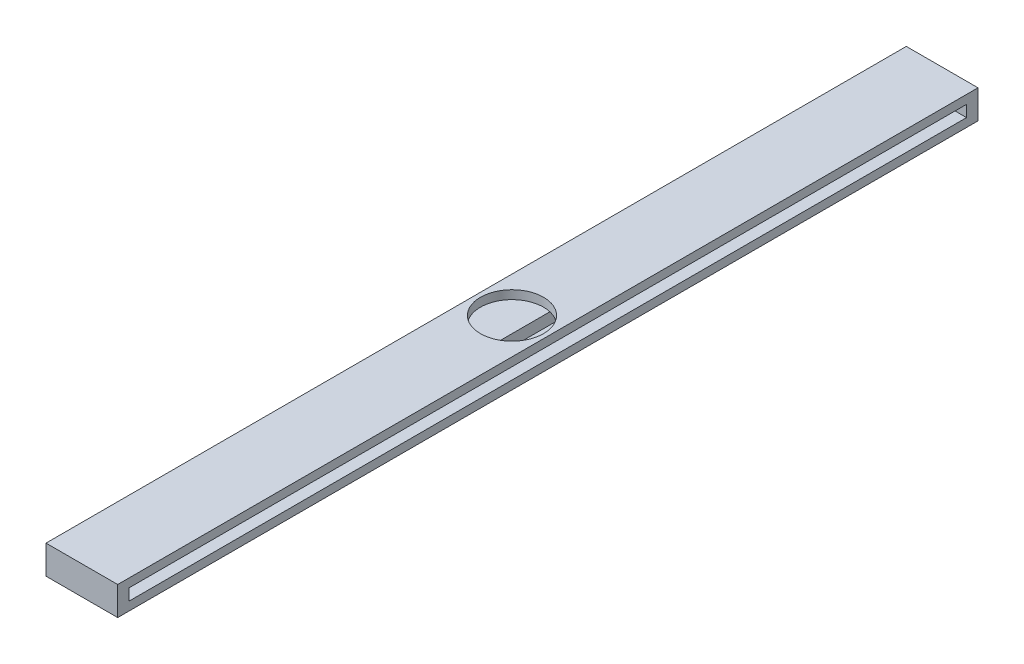
ISO-10303-21;
HEADER;
FILE_DESCRIPTION(('STEP AP214'),'2;1');
FILE_NAME('part.step','',(''),(''),'','','');
FILE_SCHEMA(('AUTOMOTIVE_DESIGN { 1 0 10303 214 1 1 1 1 }'));
ENDSEC;
DATA;
#1=APPLICATION_CONTEXT('core data for automotive mechanical design processes');
#2=APPLICATION_PROTOCOL_DEFINITION('international standard','automotive_design',2000,#1);
#3=PRODUCT_CONTEXT('',#1,'mechanical');
#4=PRODUCT('Part','Part','',(#3));
#5=PRODUCT_RELATED_PRODUCT_CATEGORY('part','',(#4));
#6=PRODUCT_DEFINITION_FORMATION('','',#4);
#7=PRODUCT_DEFINITION_CONTEXT('part definition',#1,'design');
#8=PRODUCT_DEFINITION('design','',#6,#7);
#9=PRODUCT_DEFINITION_SHAPE('','',#8);
#10=(LENGTH_UNIT() NAMED_UNIT(*) SI_UNIT(.MILLI.,.METRE.));
#11=(NAMED_UNIT(*) PLANE_ANGLE_UNIT() SI_UNIT($,.RADIAN.));
#12=(NAMED_UNIT(*) SI_UNIT($,.STERADIAN.) SOLID_ANGLE_UNIT());
#13=UNCERTAINTY_MEASURE_WITH_UNIT(LENGTH_MEASURE(1.E-05),#10,'distance_accuracy_value','');
#14=(GEOMETRIC_REPRESENTATION_CONTEXT(3) GLOBAL_UNCERTAINTY_ASSIGNED_CONTEXT((#13)) GLOBAL_UNIT_ASSIGNED_CONTEXT((#10,
#11,#12)) REPRESENTATION_CONTEXT('',''));
#15=CARTESIAN_POINT('',(0.,0.,0.));
#16=DIRECTION('',(0.,0.,1.));
#17=DIRECTION('',(1.,0.,0.));
#18=AXIS2_PLACEMENT_3D('',#15,#16,#17);
#19=CARTESIAN_POINT('',(-47.3362158107153,4.,-84.2911094295835));
#20=DIRECTION('',(-1.,0.,0.));
#21=DIRECTION('',(0.,0.,1.));
#22=AXIS2_PLACEMENT_3D('',#19,#20,#21);
#23=PLANE('',#22);
#24=DIRECTION('',(0.,1.,0.));
#25=VECTOR('',#24,1.);
#26=CARTESIAN_POINT('',(-47.3362158107153,4.,211.708890570417));
#27=LINE('',#26,#25);
#28=CARTESIAN_POINT('',(-47.3362158107153,0.,211.708890570417));
#29=VERTEX_POINT('',#28);
#30=CARTESIAN_POINT('',(-47.3362158107153,4.,211.708890570417));
#31=VERTEX_POINT('',#30);
#32=EDGE_CURVE('E152',#29,#31,#27,.T.);
#33=ORIENTED_EDGE('',*,*,#32,.F.);
#34=DIRECTION('',(0.,0.,-1.));
#35=VECTOR('',#34,1.);
#36=CARTESIAN_POINT('',(-47.3362158107153,0.,-84.2911094295835));
#37=LINE('',#36,#35);
#38=CARTESIAN_POINT('',(-47.3362158107153,0.,-80.2911094295835));
#39=VERTEX_POINT('',#38);
#40=EDGE_CURVE('E131',#29,#39,#37,.T.);
#41=ORIENTED_EDGE('',*,*,#40,.T.);
#42=DIRECTION('',(0.,-1.,0.));
#43=VECTOR('',#42,1.);
#44=CARTESIAN_POINT('',(-47.3362158107153,4.,-80.2911094295835));
#45=LINE('',#44,#43);
#46=CARTESIAN_POINT('',(-47.3362158107153,4.,-80.2911094295835));
#47=VERTEX_POINT('',#46);
#48=EDGE_CURVE('E150',#47,#39,#45,.T.);
#49=ORIENTED_EDGE('',*,*,#48,.F.);
#50=DIRECTION('',(0.,0.,-1.));
#51=VECTOR('',#50,1.);
#52=CARTESIAN_POINT('',(-47.3362158107153,4.,-84.2911094295835));
#53=LINE('',#52,#51);
#54=CARTESIAN_POINT('',(-47.3362158107153,4.,54.9967479276022));
#55=VERTEX_POINT('',#54);
#56=EDGE_CURVE('E63',#55,#47,#53,.T.);
#57=ORIENTED_EDGE('',*,*,#56,.F.);
#58=CARTESIAN_POINT('',(-47.3362158107153,4.,76.4210332132308));
#59=VERTEX_POINT('',#58);
#60=EDGE_CURVE('E112',#59,#55,#53,.T.);
#61=ORIENTED_EDGE('',*,*,#60,.F.);
#62=EDGE_CURVE('E123',#31,#59,#53,.T.);
#63=ORIENTED_EDGE('',*,*,#62,.F.);
#64=EDGE_LOOP('',(#33,#41,#49,#57,#61,#63));
#65=FACE_BOUND('',#64,.T.);
#66=ADVANCED_FACE('F41',(#65),#23,.F.);
#67=CARTESIAN_POINT('',(-62.3362158107153,4.,-84.2911094295835));
#68=DIRECTION('',(1.,0.,0.));
#69=DIRECTION('',(0.,0.,-1.));
#70=AXIS2_PLACEMENT_3D('',#67,#68,#69);
#71=PLANE('',#70);
#72=DIRECTION('',(0.,-1.,0.));
#73=VECTOR('',#72,1.);
#74=CARTESIAN_POINT('',(-62.3362158107153,4.,-84.2911094295835));
#75=LINE('',#74,#73);
#76=CARTESIAN_POINT('',(-62.3362158107153,7.,-84.2911094295835));
#77=VERTEX_POINT('',#76);
#78=CARTESIAN_POINT('',(-62.3362158107153,-3.,-84.2911094295835));
#79=VERTEX_POINT('',#78);
#80=EDGE_CURVE('E49',#77,#79,#75,.T.);
#81=ORIENTED_EDGE('',*,*,#80,.T.);
#82=DIRECTION('',(0.,0.,-1.));
#83=VECTOR('',#82,1.);
#84=CARTESIAN_POINT('',(-62.3362158107153,-3.,215.708890570417));
#85=LINE('',#84,#83);
#86=CARTESIAN_POINT('',(-62.3362158107153,-3.,215.708890570417));
#87=VERTEX_POINT('',#86);
#88=EDGE_CURVE('E194',#87,#79,#85,.T.);
#89=ORIENTED_EDGE('',*,*,#88,.F.);
#90=DIRECTION('',(0.,-1.,0.));
#91=VECTOR('',#90,1.);
#92=CARTESIAN_POINT('',(-62.3362158107153,4.,215.708890570417));
#93=LINE('',#92,#91);
#94=CARTESIAN_POINT('',(-62.3362158107153,7.,215.708890570417));
#95=VERTEX_POINT('',#94);
#96=EDGE_CURVE('E11',#95,#87,#93,.T.);
#97=ORIENTED_EDGE('',*,*,#96,.F.);
#98=DIRECTION('',(0.,0.,1.));
#99=VECTOR('',#98,1.);
#100=CARTESIAN_POINT('',(-62.3362158107153,7.,-84.2911094295835));
#101=LINE('',#100,#99);
#102=EDGE_CURVE('E184',#77,#95,#101,.T.);
#103=ORIENTED_EDGE('',*,*,#102,.F.);
#104=EDGE_LOOP('',(#81,#89,#97,#103));
#105=FACE_BOUND('',#104,.T.);
#106=ADVANCED_FACE('F43',(#105),#71,.F.);
#107=CARTESIAN_POINT('',(-62.3362158107153,4.,215.708890570417));
#108=DIRECTION('',(0.,0.,-1.));
#109=DIRECTION('',(-1.,0.,0.));
#110=AXIS2_PLACEMENT_3D('',#107,#108,#109);
#111=PLANE('',#110);
#112=ORIENTED_EDGE('',*,*,#96,.T.);
#113=DIRECTION('',(-1.,0.,0.));
#114=VECTOR('',#113,1.);
#115=CARTESIAN_POINT('',(-62.3362158107153,-3.,215.708890570417));
#116=LINE('',#115,#114);
#117=CARTESIAN_POINT('',(-37.3362158107153,-3.,215.708890570417));
#118=VERTEX_POINT('',#117);
#119=EDGE_CURVE('E185',#118,#87,#116,.T.);
#120=ORIENTED_EDGE('',*,*,#119,.F.);
#121=DIRECTION('',(0.,-1.,0.));
#122=VECTOR('',#121,1.);
#123=CARTESIAN_POINT('',(-37.3362158107153,4.,215.708890570417));
#124=LINE('',#123,#122);
#125=CARTESIAN_POINT('',(-37.3362158107153,7.,215.708890570417));
#126=VERTEX_POINT('',#125);
#127=EDGE_CURVE('E186',#126,#118,#124,.T.);
#128=ORIENTED_EDGE('',*,*,#127,.F.);
#129=DIRECTION('',(1.,0.,0.));
#130=VECTOR('',#129,1.);
#131=CARTESIAN_POINT('',(-62.3362158107153,7.,215.708890570417));
#132=LINE('',#131,#130);
#133=EDGE_CURVE('E175',#95,#126,#132,.T.);
#134=ORIENTED_EDGE('',*,*,#133,.F.);
#135=EDGE_LOOP('',(#112,#120,#128,#134));
#136=FACE_BOUND('',#135,.T.);
#137=ADVANCED_FACE('F207',(#136),#111,.F.);
#138=CARTESIAN_POINT('',(-62.3362158107153,4.,-84.2911094295835));
#139=DIRECTION('',(0.,0.,1.));
#140=DIRECTION('',(1.,0.,0.));
#141=AXIS2_PLACEMENT_3D('',#138,#139,#140);
#142=PLANE('',#141);
#143=DIRECTION('',(0.,1.,0.));
#144=VECTOR('',#143,1.);
#145=CARTESIAN_POINT('',(-37.3362158107153,4.,-84.2911094295835));
#146=LINE('',#145,#144);
#147=CARTESIAN_POINT('',(-37.3362158107153,-3.,-84.2911094295835));
#148=VERTEX_POINT('',#147);
#149=CARTESIAN_POINT('',(-37.3362158107153,7.,-84.2911094295835));
#150=VERTEX_POINT('',#149);
#151=EDGE_CURVE('E153',#148,#150,#146,.T.);
#152=ORIENTED_EDGE('',*,*,#151,.F.);
#153=DIRECTION('',(1.,0.,0.));
#154=VECTOR('',#153,1.);
#155=CARTESIAN_POINT('',(-62.3362158107153,-3.,-84.2911094295835));
#156=LINE('',#155,#154);
#157=EDGE_CURVE('E197',#79,#148,#156,.T.);
#158=ORIENTED_EDGE('',*,*,#157,.F.);
#159=ORIENTED_EDGE('',*,*,#80,.F.);
#160=DIRECTION('',(-1.,0.,0.));
#161=VECTOR('',#160,1.);
#162=CARTESIAN_POINT('',(-62.3362158107153,7.,-84.2911094295835));
#163=LINE('',#162,#161);
#164=EDGE_CURVE('E147',#150,#77,#163,.T.);
#165=ORIENTED_EDGE('',*,*,#164,.F.);
#166=EDGE_LOOP('',(#152,#158,#159,#165));
#167=FACE_BOUND('',#166,.T.);
#168=ADVANCED_FACE('F177',(#167),#142,.F.);
#169=CARTESIAN_POINT('',(-37.3362158107153,4.,-80.2911094295835));
#170=DIRECTION('',(0.,0.,-1.));
#171=DIRECTION('',(-1.,0.,0.));
#172=AXIS2_PLACEMENT_3D('',#169,#170,#171);
#173=PLANE('',#172);
#174=ORIENTED_EDGE('',*,*,#48,.T.);
#175=DIRECTION('',(-1.,0.,0.));
#176=VECTOR('',#175,1.);
#177=CARTESIAN_POINT('',(-37.3362158107153,0.,-80.2911094295835));
#178=LINE('',#177,#176);
#179=CARTESIAN_POINT('',(-37.3362158107153,0.,-80.2911094295835));
#180=VERTEX_POINT('',#179);
#181=EDGE_CURVE('E146',#180,#39,#178,.T.);
#182=ORIENTED_EDGE('',*,*,#181,.F.);
#183=DIRECTION('',(0.,-1.,0.));
#184=VECTOR('',#183,1.);
#185=CARTESIAN_POINT('',(-37.3362158107153,4.,-80.2911094295835));
#186=LINE('',#185,#184);
#187=CARTESIAN_POINT('',(-37.3362158107153,4.,-80.2911094295835));
#188=VERTEX_POINT('',#187);
#189=EDGE_CURVE('E149',#188,#180,#186,.T.);
#190=ORIENTED_EDGE('',*,*,#189,.F.);
#191=DIRECTION('',(-1.,0.,0.));
#192=VECTOR('',#191,1.);
#193=CARTESIAN_POINT('',(-37.3362158107153,4.,-80.2911094295835));
#194=LINE('',#193,#192);
#195=EDGE_CURVE('E143',#188,#47,#194,.T.);
#196=ORIENTED_EDGE('',*,*,#195,.T.);
#197=EDGE_LOOP('',(#174,#182,#190,#196));
#198=FACE_BOUND('',#197,.T.);
#199=ADVANCED_FACE('F237',(#198),#173,.F.);
#200=CARTESIAN_POINT('',(-37.3362158107153,4.,211.708890570417));
#201=DIRECTION('',(0.,0.,1.));
#202=DIRECTION('',(1.,0.,0.));
#203=AXIS2_PLACEMENT_3D('',#200,#201,#202);
#204=PLANE('',#203);
#205=ORIENTED_EDGE('',*,*,#32,.T.);
#206=DIRECTION('',(-1.,0.,0.));
#207=VECTOR('',#206,1.);
#208=CARTESIAN_POINT('',(-37.3362158107153,4.,211.708890570417));
#209=LINE('',#208,#207);
#210=CARTESIAN_POINT('',(-37.3362158107153,4.,211.708890570417));
#211=VERTEX_POINT('',#210);
#212=EDGE_CURVE('E128',#211,#31,#209,.T.);
#213=ORIENTED_EDGE('',*,*,#212,.F.);
#214=DIRECTION('',(0.,1.,0.));
#215=VECTOR('',#214,1.);
#216=CARTESIAN_POINT('',(-37.3362158107153,4.,211.708890570417));
#217=LINE('',#216,#215);
#218=CARTESIAN_POINT('',(-37.3362158107153,0.,211.708890570417));
#219=VERTEX_POINT('',#218);
#220=EDGE_CURVE('E139',#219,#211,#217,.T.);
#221=ORIENTED_EDGE('',*,*,#220,.F.);
#222=DIRECTION('',(-1.,0.,0.));
#223=VECTOR('',#222,1.);
#224=CARTESIAN_POINT('',(-37.3362158107153,0.,211.708890570417));
#225=LINE('',#224,#223);
#226=EDGE_CURVE('E133',#219,#29,#225,.T.);
#227=ORIENTED_EDGE('',*,*,#226,.T.);
#228=EDGE_LOOP('',(#205,#213,#221,#227));
#229=FACE_BOUND('',#228,.T.);
#230=ADVANCED_FACE('F189',(#229),#204,.F.);
#231=CARTESIAN_POINT('',(-37.3362158107153,0.,0.));
#232=DIRECTION('',(1.,0.,0.));
#233=DIRECTION('',(0.,0.,-1.));
#234=AXIS2_PLACEMENT_3D('',#231,#232,#233);
#235=PLANE('',#234);
#236=DIRECTION('',(0.,0.,1.));
#237=VECTOR('',#236,1.);
#238=CARTESIAN_POINT('',(-37.3362158107153,-3.,215.708890570417));
#239=LINE('',#238,#237);
#240=EDGE_CURVE('E163',#148,#118,#239,.T.);
#241=ORIENTED_EDGE('',*,*,#240,.F.);
#242=ORIENTED_EDGE('',*,*,#151,.T.);
#243=DIRECTION('',(0.,0.,-1.));
#244=VECTOR('',#243,1.);
#245=CARTESIAN_POINT('',(-37.3362158107153,7.,-84.2911094295835));
#246=LINE('',#245,#244);
#247=EDGE_CURVE('E161',#126,#150,#246,.T.);
#248=ORIENTED_EDGE('',*,*,#247,.F.);
#249=ORIENTED_EDGE('',*,*,#127,.T.);
#250=EDGE_LOOP('',(#241,#242,#248,#249));
#251=FACE_BOUND('',#250,.T.);
#252=ORIENTED_EDGE('',*,*,#189,.T.);
#253=DIRECTION('',(0.,0.,1.));
#254=VECTOR('',#253,1.);
#255=CARTESIAN_POINT('',(-37.3362158107153,0.,215.708890570417));
#256=LINE('',#255,#254);
#257=EDGE_CURVE('E119',#180,#219,#256,.T.);
#258=ORIENTED_EDGE('',*,*,#257,.T.);
#259=ORIENTED_EDGE('',*,*,#220,.T.);
#260=DIRECTION('',(0.,0.,-1.));
#261=VECTOR('',#260,1.);
#262=CARTESIAN_POINT('',(-37.3362158107153,4.,-84.2911094295835));
#263=LINE('',#262,#261);
#264=EDGE_CURVE('E181',#211,#188,#263,.T.);
#265=ORIENTED_EDGE('',*,*,#264,.T.);
#266=EDGE_LOOP('',(#252,#258,#259,#265));
#267=FACE_BOUND('',#266,.T.);
#268=ADVANCED_FACE('F159',(#251,#267),#235,.T.);
#269=CARTESIAN_POINT('',(0.,4.,0.));
#270=DIRECTION('',(0.,1.,0.));
#271=DIRECTION('',(0.,0.,1.));
#272=AXIS2_PLACEMENT_3D('',#269,#270,#271);
#273=PLANE('',#272);
#274=ORIENTED_EDGE('',*,*,#62,.T.);
#275=CARTESIAN_POINT('',(-49.8362158107153,4.,65.7088905704165));
#276=DIRECTION('',(0.,1.,0.));
#277=DIRECTION('',(0.,0.,1.));
#278=AXIS2_PLACEMENT_3D('',#275,#276,#277);
#279=CIRCLE('',#278,11.);
#280=EDGE_CURVE('E113',#59,#55,#279,.T.);
#281=ORIENTED_EDGE('',*,*,#280,.T.);
#282=ORIENTED_EDGE('',*,*,#56,.T.);
#283=ORIENTED_EDGE('',*,*,#195,.F.);
#284=ORIENTED_EDGE('',*,*,#264,.F.);
#285=ORIENTED_EDGE('',*,*,#212,.T.);
#286=EDGE_LOOP('',(#274,#281,#282,#283,#284,#285));
#287=FACE_BOUND('',#286,.T.);
#288=ADVANCED_FACE('F126',(#287),#273,.F.);
#289=CARTESIAN_POINT('',(0.,7.,0.));
#290=DIRECTION('',(0.,1.,0.));
#291=DIRECTION('',(0.,0.,1.));
#292=AXIS2_PLACEMENT_3D('',#289,#290,#291);
#293=PLANE('',#292);
#294=CARTESIAN_POINT('',(-49.8362158107153,7.,65.7088905704165));
#295=DIRECTION('',(0.,1.,0.));
#296=DIRECTION('',(0.,0.,1.));
#297=AXIS2_PLACEMENT_3D('',#294,#295,#296);
#298=CIRCLE('',#297,11.);
#299=CARTESIAN_POINT('',(-49.8362158107153,7.,76.7088905704165));
#300=VERTEX_POINT('',#299);
#301=EDGE_CURVE('E114',#300,#300,#298,.T.);
#302=ORIENTED_EDGE('',*,*,#301,.F.);
#303=EDGE_LOOP('',(#302));
#304=FACE_BOUND('',#303,.T.);
#305=ORIENTED_EDGE('',*,*,#102,.T.);
#306=ORIENTED_EDGE('',*,*,#133,.T.);
#307=ORIENTED_EDGE('',*,*,#247,.T.);
#308=ORIENTED_EDGE('',*,*,#164,.T.);
#309=EDGE_LOOP('',(#305,#306,#307,#308));
#310=FACE_BOUND('',#309,.T.);
#311=ADVANCED_FACE('F172',(#304,#310),#293,.T.);
#312=CARTESIAN_POINT('',(0.,0.,0.));
#313=DIRECTION('',(0.,-1.,0.));
#314=DIRECTION('',(0.,0.,-1.));
#315=AXIS2_PLACEMENT_3D('',#312,#313,#314);
#316=PLANE('',#315);
#317=ORIENTED_EDGE('',*,*,#257,.F.);
#318=ORIENTED_EDGE('',*,*,#181,.T.);
#319=ORIENTED_EDGE('',*,*,#40,.F.);
#320=ORIENTED_EDGE('',*,*,#226,.F.);
#321=EDGE_LOOP('',(#317,#318,#319,#320));
#322=FACE_BOUND('',#321,.T.);
#323=ADVANCED_FACE('F216',(#322),#316,.F.);
#324=CARTESIAN_POINT('',(0.,-3.,0.));
#325=DIRECTION('',(0.,-1.,0.));
#326=DIRECTION('',(0.,0.,-1.));
#327=AXIS2_PLACEMENT_3D('',#324,#325,#326);
#328=PLANE('',#327);
#329=ORIENTED_EDGE('',*,*,#88,.T.);
#330=ORIENTED_EDGE('',*,*,#157,.T.);
#331=ORIENTED_EDGE('',*,*,#240,.T.);
#332=ORIENTED_EDGE('',*,*,#119,.T.);
#333=EDGE_LOOP('',(#329,#330,#331,#332));
#334=FACE_BOUND('',#333,.T.);
#335=ADVANCED_FACE('F209',(#334),#328,.T.);
#336=CARTESIAN_POINT('',(-49.8362158107153,4.,65.7088905704165));
#337=DIRECTION('',(0.,1.,0.));
#338=DIRECTION('',(0.,0.,1.));
#339=AXIS2_PLACEMENT_3D('',#336,#337,#338);
#340=PLANE('',#339);
#341=ORIENTED_EDGE('',*,*,#60,.T.);
#342=EDGE_CURVE('E55',#55,#59,#279,.T.);
#343=ORIENTED_EDGE('',*,*,#342,.T.);
#344=EDGE_LOOP('',(#341,#343));
#345=FACE_BOUND('',#344,.T.);
#346=ADVANCED_FACE('F110',(#345),#340,.T.);
#347=CARTESIAN_POINT('',(-49.8362158107153,4.,65.7088905704165));
#348=DIRECTION('',(0.,1.,0.));
#349=DIRECTION('',(0.,0.,1.));
#350=AXIS2_PLACEMENT_3D('',#347,#348,#349);
#351=CYLINDRICAL_SURFACE('',#350,11.);
#352=ORIENTED_EDGE('',*,*,#280,.F.);
#353=ORIENTED_EDGE('',*,*,#342,.F.);
#354=EDGE_LOOP('',(#352,#353));
#355=FACE_BOUND('',#354,.T.);
#356=ORIENTED_EDGE('',*,*,#301,.T.);
#357=EDGE_LOOP('',(#356));
#358=FACE_BOUND('',#357,.T.);
#359=ADVANCED_FACE('F116',(#355,#358),#351,.F.);
#360=CLOSED_SHELL('',(#66,#106,#137,#168,#199,#230,#268,#288,#311,#323,#335,#346,#359));
#361=MANIFOLD_SOLID_BREP('B2',#360);
#362=ADVANCED_BREP_SHAPE_REPRESENTATION('',(#18,#361),#14);
#363=SHAPE_DEFINITION_REPRESENTATION(#9,#362);
ENDSEC;
END-ISO-10303-21;
